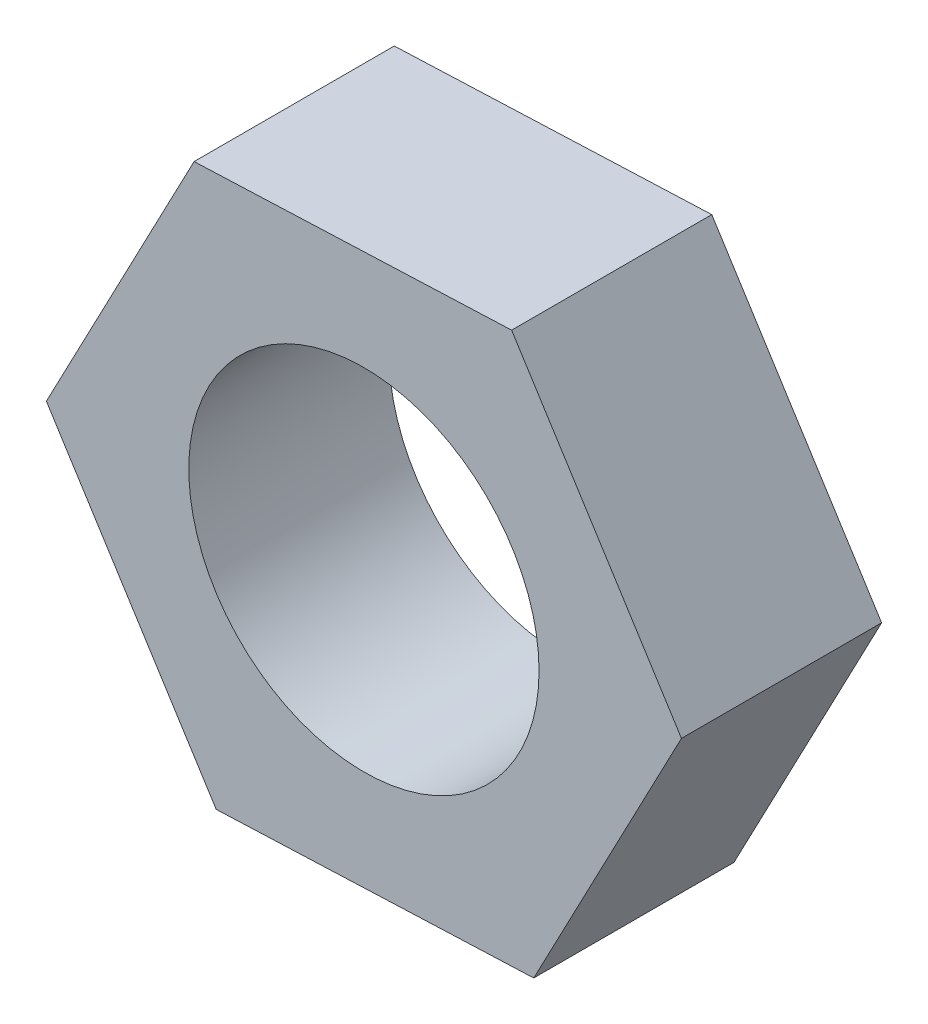
ISO-10303-21;
HEADER;
FILE_DESCRIPTION(('STEP AP214'),'2;1');
FILE_NAME('part.step','',(''),(''),'','','');
FILE_SCHEMA(('AUTOMOTIVE_DESIGN { 1 0 10303 214 1 1 1 1 }'));
ENDSEC;
DATA;
#1=APPLICATION_CONTEXT('core data for automotive mechanical design processes');
#2=APPLICATION_PROTOCOL_DEFINITION('international standard','automotive_design',2000,#1);
#3=PRODUCT_CONTEXT('',#1,'mechanical');
#4=PRODUCT('Part','Part','',(#3));
#5=PRODUCT_RELATED_PRODUCT_CATEGORY('part','',(#4));
#6=PRODUCT_DEFINITION_FORMATION('','',#4);
#7=PRODUCT_DEFINITION_CONTEXT('part definition',#1,'design');
#8=PRODUCT_DEFINITION('design','',#6,#7);
#9=PRODUCT_DEFINITION_SHAPE('','',#8);
#10=(LENGTH_UNIT() NAMED_UNIT(*) SI_UNIT(.MILLI.,.METRE.));
#11=(NAMED_UNIT(*) PLANE_ANGLE_UNIT() SI_UNIT($,.RADIAN.));
#12=(NAMED_UNIT(*) SI_UNIT($,.STERADIAN.) SOLID_ANGLE_UNIT());
#13=UNCERTAINTY_MEASURE_WITH_UNIT(LENGTH_MEASURE(1.E-05),#10,'distance_accuracy_value','');
#14=(GEOMETRIC_REPRESENTATION_CONTEXT(3) GLOBAL_UNCERTAINTY_ASSIGNED_CONTEXT((#13)) GLOBAL_UNIT_ASSIGNED_CONTEXT((#10,
#11,#12)) REPRESENTATION_CONTEXT('',''));
#15=CARTESIAN_POINT('',(0.,0.,0.));
#16=DIRECTION('',(0.,0.,1.));
#17=DIRECTION('',(1.,0.,0.));
#18=AXIS2_PLACEMENT_3D('',#15,#16,#17);
#19=CARTESIAN_POINT('',(0.,0.,4.));
#20=DIRECTION('',(0.,0.,1.));
#21=DIRECTION('',(1.,0.,0.));
#22=AXIS2_PLACEMENT_3D('',#19,#20,#21);
#23=PLANE('',#22);
#24=DIRECTION('',(0.999191628481979,0.0402006165565949,0.));
#25=VECTOR('',#24,1.);
#26=CARTESIAN_POINT('',(-2.95175616515723,-5.62320805899885,4.));
#27=LINE('',#26,#25);
#28=CARTESIAN_POINT('',(-2.95175616515723,-5.62320805899885,4.));
#29=VERTEX_POINT('',#28);
#30=CARTESIAN_POINT('',(3.39396294727977,-5.36789985430292,4.));
#31=VERTEX_POINT('',#30);
#32=EDGE_CURVE('E148',#29,#31,#27,.T.);
#33=ORIENTED_EDGE('',*,*,#32,.T.);
#34=DIRECTION('',(0.464781059055181,0.885425641792434,0.));
#35=VECTOR('',#34,1.);
#36=CARTESIAN_POINT('',(3.39396294727977,-5.36789985430292,4.));
#37=LINE('',#36,#35);
#38=CARTESIAN_POINT('',(6.345719112437,0.25530820469593,4.));
#39=VERTEX_POINT('',#38);
#40=EDGE_CURVE('E96',#31,#39,#37,.T.);
#41=ORIENTED_EDGE('',*,*,#40,.T.);
#42=DIRECTION('',(-0.534410569426798,0.845225025235839,0.));
#43=VECTOR('',#42,1.);
#44=CARTESIAN_POINT('',(6.345719112437,0.25530820469593,4.));
#45=LINE('',#44,#43);
#46=CARTESIAN_POINT('',(2.95175616515723,5.62320805899885,4.));
#47=VERTEX_POINT('',#46);
#48=EDGE_CURVE('E109',#39,#47,#45,.T.);
#49=ORIENTED_EDGE('',*,*,#48,.T.);
#50=DIRECTION('',(-0.999191628481979,-0.0402006165565947,0.));
#51=VECTOR('',#50,1.);
#52=CARTESIAN_POINT('',(2.95175616515723,5.62320805899885,4.));
#53=LINE('',#52,#51);
#54=CARTESIAN_POINT('',(-3.39396294727977,5.36789985430292,4.));
#55=VERTEX_POINT('',#54);
#56=EDGE_CURVE('E103',#47,#55,#53,.T.);
#57=ORIENTED_EDGE('',*,*,#56,.T.);
#58=DIRECTION('',(-0.464781059055181,-0.885425641792434,0.));
#59=VECTOR('',#58,1.);
#60=CARTESIAN_POINT('',(-3.39396294727977,5.36789985430292,4.));
#61=LINE('',#60,#59);
#62=CARTESIAN_POINT('',(-6.345719112437,-0.255308204695927,4.));
#63=VERTEX_POINT('',#62);
#64=EDGE_CURVE('E107',#55,#63,#61,.T.);
#65=ORIENTED_EDGE('',*,*,#64,.T.);
#66=DIRECTION('',(0.534410569426798,-0.84522502523584,0.));
#67=VECTOR('',#66,1.);
#68=CARTESIAN_POINT('',(-6.345719112437,-0.255308204695927,4.));
#69=LINE('',#68,#67);
#70=EDGE_CURVE('E59',#63,#29,#69,.T.);
#71=ORIENTED_EDGE('',*,*,#70,.T.);
#72=EDGE_LOOP('',(#33,#41,#49,#57,#65,#71));
#73=FACE_BOUND('',#72,.T.);
#74=CARTESIAN_POINT('',(0.,0.,4.));
#75=DIRECTION('',(0.,0.,1.));
#76=DIRECTION('',(1.,0.,0.));
#77=AXIS2_PLACEMENT_3D('',#74,#75,#76);
#78=CIRCLE('',#77,3.5);
#79=CARTESIAN_POINT('',(3.5,0.,4.));
#80=VERTEX_POINT('',#79);
#81=EDGE_CURVE('E136',#80,#80,#78,.T.);
#82=ORIENTED_EDGE('',*,*,#81,.F.);
#83=EDGE_LOOP('',(#82));
#84=FACE_BOUND('',#83,.T.);
#85=ADVANCED_FACE('F41',(#73,#84),#23,.T.);
#86=CARTESIAN_POINT('',(0.,0.,0.));
#87=DIRECTION('',(0.,0.,1.));
#88=DIRECTION('',(1.,0.,0.));
#89=AXIS2_PLACEMENT_3D('',#86,#87,#88);
#90=PLANE('',#89);
#91=DIRECTION('',(0.999191628481979,0.0402006165565949,0.));
#92=VECTOR('',#91,1.);
#93=CARTESIAN_POINT('',(-2.95175616515723,-5.62320805899885,0.));
#94=LINE('',#93,#92);
#95=CARTESIAN_POINT('',(-2.95175616515723,-5.62320805899885,0.));
#96=VERTEX_POINT('',#95);
#97=CARTESIAN_POINT('',(3.39396294727977,-5.36789985430292,0.));
#98=VERTEX_POINT('',#97);
#99=EDGE_CURVE('E131',#96,#98,#94,.T.);
#100=ORIENTED_EDGE('',*,*,#99,.F.);
#101=DIRECTION('',(0.534410569426798,-0.84522502523584,0.));
#102=VECTOR('',#101,1.);
#103=CARTESIAN_POINT('',(-6.345719112437,-0.255308204695927,0.));
#104=LINE('',#103,#102);
#105=CARTESIAN_POINT('',(-6.345719112437,-0.255308204695927,0.));
#106=VERTEX_POINT('',#105);
#107=EDGE_CURVE('E88',#106,#96,#104,.T.);
#108=ORIENTED_EDGE('',*,*,#107,.F.);
#109=DIRECTION('',(-0.464781059055181,-0.885425641792434,0.));
#110=VECTOR('',#109,1.);
#111=CARTESIAN_POINT('',(-3.39396294727977,5.36789985430292,0.));
#112=LINE('',#111,#110);
#113=CARTESIAN_POINT('',(-3.39396294727977,5.36789985430292,0.));
#114=VERTEX_POINT('',#113);
#115=EDGE_CURVE('E82',#114,#106,#112,.T.);
#116=ORIENTED_EDGE('',*,*,#115,.F.);
#117=DIRECTION('',(-0.999191628481979,-0.0402006165565947,0.));
#118=VECTOR('',#117,1.);
#119=CARTESIAN_POINT('',(2.95175616515723,5.62320805899885,0.));
#120=LINE('',#119,#118);
#121=CARTESIAN_POINT('',(2.95175616515723,5.62320805899885,0.));
#122=VERTEX_POINT('',#121);
#123=EDGE_CURVE('E118',#122,#114,#120,.T.);
#124=ORIENTED_EDGE('',*,*,#123,.F.);
#125=DIRECTION('',(-0.534410569426798,0.845225025235839,0.));
#126=VECTOR('',#125,1.);
#127=CARTESIAN_POINT('',(6.345719112437,0.25530820469593,0.));
#128=LINE('',#127,#126);
#129=CARTESIAN_POINT('',(6.345719112437,0.25530820469593,0.));
#130=VERTEX_POINT('',#129);
#131=EDGE_CURVE('E139',#130,#122,#128,.T.);
#132=ORIENTED_EDGE('',*,*,#131,.F.);
#133=DIRECTION('',(0.464781059055181,0.885425641792434,0.));
#134=VECTOR('',#133,1.);
#135=CARTESIAN_POINT('',(3.39396294727977,-5.36789985430292,0.));
#136=LINE('',#135,#134);
#137=EDGE_CURVE('E135',#98,#130,#136,.T.);
#138=ORIENTED_EDGE('',*,*,#137,.F.);
#139=EDGE_LOOP('',(#100,#108,#116,#124,#132,#138));
#140=FACE_BOUND('',#139,.T.);
#141=CARTESIAN_POINT('',(0.,0.,0.));
#142=DIRECTION('',(0.,0.,1.));
#143=DIRECTION('',(1.,0.,0.));
#144=AXIS2_PLACEMENT_3D('',#141,#142,#143);
#145=CIRCLE('',#144,3.5);
#146=CARTESIAN_POINT('',(3.5,0.,0.));
#147=VERTEX_POINT('',#146);
#148=EDGE_CURVE('E245',#147,#147,#145,.T.);
#149=ORIENTED_EDGE('',*,*,#148,.T.);
#150=EDGE_LOOP('',(#149));
#151=FACE_BOUND('',#150,.T.);
#152=ADVANCED_FACE('F161',(#140,#151),#90,.F.);
#153=CARTESIAN_POINT('',(-2.95175616515723,-5.62320805899885,4.));
#154=DIRECTION('',(-0.0402006165565949,0.999191628481979,0.));
#155=DIRECTION('',(-0.999191628481979,-0.0402006165565949,0.));
#156=AXIS2_PLACEMENT_3D('',#153,#154,#155);
#157=PLANE('',#156);
#158=ORIENTED_EDGE('',*,*,#99,.T.);
#159=DIRECTION('',(0.,0.,-1.));
#160=VECTOR('',#159,1.);
#161=CARTESIAN_POINT('',(3.39396294727977,-5.36789985430292,4.));
#162=LINE('',#161,#160);
#163=EDGE_CURVE('E11',#31,#98,#162,.T.);
#164=ORIENTED_EDGE('',*,*,#163,.F.);
#165=ORIENTED_EDGE('',*,*,#32,.F.);
#166=DIRECTION('',(0.,0.,-1.));
#167=VECTOR('',#166,1.);
#168=CARTESIAN_POINT('',(-2.95175616515723,-5.62320805899885,4.));
#169=LINE('',#168,#167);
#170=EDGE_CURVE('E127',#29,#96,#169,.T.);
#171=ORIENTED_EDGE('',*,*,#170,.T.);
#172=EDGE_LOOP('',(#158,#164,#165,#171));
#173=FACE_BOUND('',#172,.T.);
#174=ADVANCED_FACE('F43',(#173),#157,.F.);
#175=CARTESIAN_POINT('',(3.39396294727977,-5.36789985430292,4.));
#176=DIRECTION('',(-0.885425641792434,0.464781059055181,0.));
#177=DIRECTION('',(-0.464781059055181,-0.885425641792434,0.));
#178=AXIS2_PLACEMENT_3D('',#175,#176,#177);
#179=PLANE('',#178);
#180=ORIENTED_EDGE('',*,*,#137,.T.);
#181=DIRECTION('',(0.,0.,-1.));
#182=VECTOR('',#181,1.);
#183=CARTESIAN_POINT('',(6.345719112437,0.25530820469593,4.));
#184=LINE('',#183,#182);
#185=EDGE_CURVE('E51',#39,#130,#184,.T.);
#186=ORIENTED_EDGE('',*,*,#185,.F.);
#187=ORIENTED_EDGE('',*,*,#40,.F.);
#188=ORIENTED_EDGE('',*,*,#163,.T.);
#189=EDGE_LOOP('',(#180,#186,#187,#188));
#190=FACE_BOUND('',#189,.T.);
#191=ADVANCED_FACE('F186',(#190),#179,.F.);
#192=CARTESIAN_POINT('',(6.345719112437,0.25530820469593,4.));
#193=DIRECTION('',(-0.845225025235839,-0.534410569426798,0.));
#194=DIRECTION('',(0.534410569426798,-0.845225025235839,0.));
#195=AXIS2_PLACEMENT_3D('',#192,#193,#194);
#196=PLANE('',#195);
#197=ORIENTED_EDGE('',*,*,#131,.T.);
#198=DIRECTION('',(0.,0.,-1.));
#199=VECTOR('',#198,1.);
#200=CARTESIAN_POINT('',(2.95175616515723,5.62320805899885,4.));
#201=LINE('',#200,#199);
#202=EDGE_CURVE('E120',#47,#122,#201,.T.);
#203=ORIENTED_EDGE('',*,*,#202,.F.);
#204=ORIENTED_EDGE('',*,*,#48,.F.);
#205=ORIENTED_EDGE('',*,*,#185,.T.);
#206=EDGE_LOOP('',(#197,#203,#204,#205));
#207=FACE_BOUND('',#206,.T.);
#208=ADVANCED_FACE('F158',(#207),#196,.F.);
#209=CARTESIAN_POINT('',(2.95175616515723,5.62320805899885,4.));
#210=DIRECTION('',(0.0402006165565947,-0.999191628481979,0.));
#211=DIRECTION('',(0.999191628481979,0.0402006165565947,0.));
#212=AXIS2_PLACEMENT_3D('',#209,#210,#211);
#213=PLANE('',#212);
#214=ORIENTED_EDGE('',*,*,#123,.T.);
#215=DIRECTION('',(0.,0.,-1.));
#216=VECTOR('',#215,1.);
#217=CARTESIAN_POINT('',(-3.39396294727977,5.36789985430292,4.));
#218=LINE('',#217,#216);
#219=EDGE_CURVE('E115',#55,#114,#218,.T.);
#220=ORIENTED_EDGE('',*,*,#219,.F.);
#221=ORIENTED_EDGE('',*,*,#56,.F.);
#222=ORIENTED_EDGE('',*,*,#202,.T.);
#223=EDGE_LOOP('',(#214,#220,#221,#222));
#224=FACE_BOUND('',#223,.T.);
#225=ADVANCED_FACE('F116',(#224),#213,.F.);
#226=CARTESIAN_POINT('',(-3.39396294727977,5.36789985430292,4.));
#227=DIRECTION('',(0.885425641792434,-0.464781059055181,0.));
#228=DIRECTION('',(0.464781059055181,0.885425641792434,0.));
#229=AXIS2_PLACEMENT_3D('',#226,#227,#228);
#230=PLANE('',#229);
#231=ORIENTED_EDGE('',*,*,#115,.T.);
#232=DIRECTION('',(0.,0.,-1.));
#233=VECTOR('',#232,1.);
#234=CARTESIAN_POINT('',(-6.345719112437,-0.255308204695927,4.));
#235=LINE('',#234,#233);
#236=EDGE_CURVE('E121',#63,#106,#235,.T.);
#237=ORIENTED_EDGE('',*,*,#236,.F.);
#238=ORIENTED_EDGE('',*,*,#64,.F.);
#239=ORIENTED_EDGE('',*,*,#219,.T.);
#240=EDGE_LOOP('',(#231,#237,#238,#239));
#241=FACE_BOUND('',#240,.T.);
#242=ADVANCED_FACE('F123',(#241),#230,.F.);
#243=CARTESIAN_POINT('',(-6.345719112437,-0.255308204695927,4.));
#244=DIRECTION('',(0.84522502523584,0.534410569426798,0.));
#245=DIRECTION('',(-0.534410569426798,0.84522502523584,0.));
#246=AXIS2_PLACEMENT_3D('',#243,#244,#245);
#247=PLANE('',#246);
#248=ORIENTED_EDGE('',*,*,#107,.T.);
#249=ORIENTED_EDGE('',*,*,#170,.F.);
#250=ORIENTED_EDGE('',*,*,#70,.F.);
#251=ORIENTED_EDGE('',*,*,#236,.T.);
#252=EDGE_LOOP('',(#248,#249,#250,#251));
#253=FACE_BOUND('',#252,.T.);
#254=ADVANCED_FACE('F166',(#253),#247,.F.);
#255=CARTESIAN_POINT('',(0.,0.,4.));
#256=DIRECTION('',(0.,0.,-1.));
#257=DIRECTION('',(-1.,0.,0.));
#258=AXIS2_PLACEMENT_3D('',#255,#256,#257);
#259=CYLINDRICAL_SURFACE('',#258,3.5);
#260=ORIENTED_EDGE('',*,*,#81,.T.);
#261=EDGE_LOOP('',(#260));
#262=FACE_BOUND('',#261,.T.);
#263=ORIENTED_EDGE('',*,*,#148,.F.);
#264=EDGE_LOOP('',(#263));
#265=FACE_BOUND('',#264,.T.);
#266=ADVANCED_FACE('F168',(#262,#265),#259,.F.);
#267=CLOSED_SHELL('',(#85,#152,#174,#191,#208,#225,#242,#254,#266));
#268=MANIFOLD_SOLID_BREP('B2',#267);
#269=ADVANCED_BREP_SHAPE_REPRESENTATION('',(#18,#268),#14);
#270=SHAPE_DEFINITION_REPRESENTATION(#9,#269);
ENDSEC;
END-ISO-10303-21;
